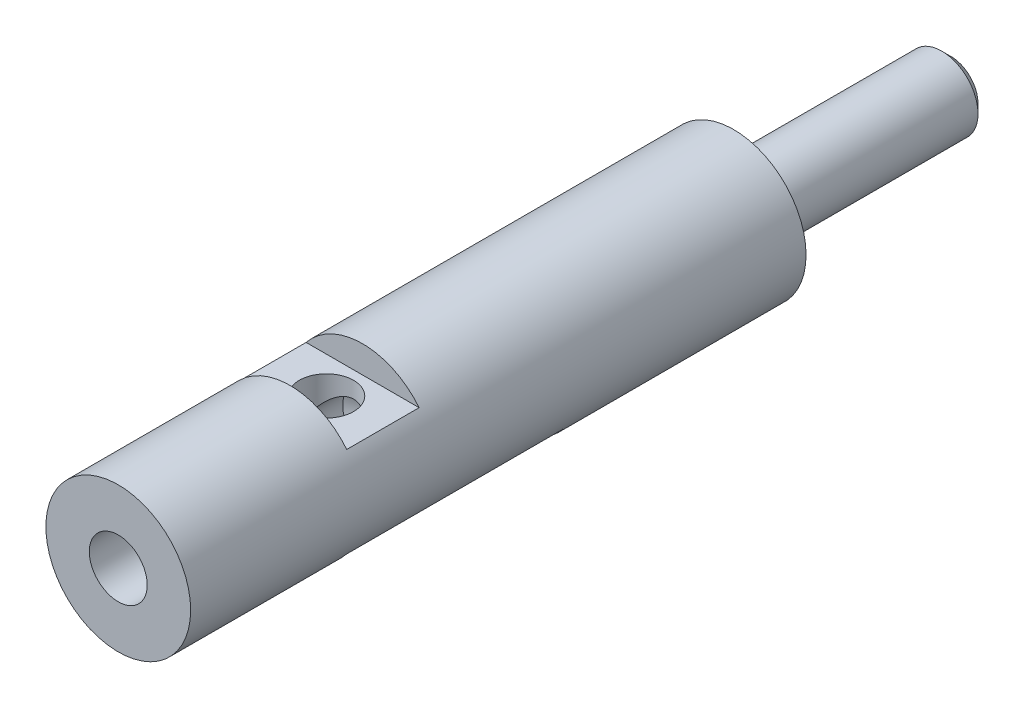
ISO-10303-21;
HEADER;
FILE_DESCRIPTION(('STEP AP214'),'2;1');
FILE_NAME('part.step','',(''),(''),'','','');
FILE_SCHEMA(('AUTOMOTIVE_DESIGN { 1 0 10303 214 1 1 1 1 }'));
ENDSEC;
DATA;
#1=APPLICATION_CONTEXT('core data for automotive mechanical design processes');
#2=APPLICATION_PROTOCOL_DEFINITION('international standard','automotive_design',2000,#1);
#3=PRODUCT_CONTEXT('',#1,'mechanical');
#4=PRODUCT('Part','Part','',(#3));
#5=PRODUCT_RELATED_PRODUCT_CATEGORY('part','',(#4));
#6=PRODUCT_DEFINITION_FORMATION('','',#4);
#7=PRODUCT_DEFINITION_CONTEXT('part definition',#1,'design');
#8=PRODUCT_DEFINITION('design','',#6,#7);
#9=PRODUCT_DEFINITION_SHAPE('','',#8);
#10=(LENGTH_UNIT() NAMED_UNIT(*) SI_UNIT(.MILLI.,.METRE.));
#11=(NAMED_UNIT(*) PLANE_ANGLE_UNIT() SI_UNIT($,.RADIAN.));
#12=(NAMED_UNIT(*) SI_UNIT($,.STERADIAN.) SOLID_ANGLE_UNIT());
#13=UNCERTAINTY_MEASURE_WITH_UNIT(LENGTH_MEASURE(1.E-05),#10,'distance_accuracy_value','');
#14=(GEOMETRIC_REPRESENTATION_CONTEXT(3) GLOBAL_UNCERTAINTY_ASSIGNED_CONTEXT((#13)) GLOBAL_UNIT_ASSIGNED_CONTEXT((#10,
#11,#12)) REPRESENTATION_CONTEXT('',''));
#15=CARTESIAN_POINT('',(0.,0.,0.));
#16=DIRECTION('',(0.,0.,1.));
#17=DIRECTION('',(1.,0.,0.));
#18=AXIS2_PLACEMENT_3D('',#15,#16,#17);
#19=CARTESIAN_POINT('',(0.,0.,-34.));
#20=DIRECTION('',(0.,0.,1.));
#21=DIRECTION('',(1.,0.,0.));
#22=AXIS2_PLACEMENT_3D('',#19,#20,#21);
#23=PLANE('',#22);
#24=CARTESIAN_POINT('',(0.,0.,-34.));
#25=DIRECTION('',(0.,0.,1.));
#26=DIRECTION('',(1.,0.,0.));
#27=AXIS2_PLACEMENT_3D('',#24,#25,#26);
#28=CIRCLE('',#27,4.);
#29=CARTESIAN_POINT('',(4.,0.,-34.));
#30=VERTEX_POINT('',#29);
#31=EDGE_CURVE('E111',#30,#30,#28,.T.);
#32=ORIENTED_EDGE('',*,*,#31,.F.);
#33=EDGE_LOOP('',(#32));
#34=FACE_BOUND('',#33,.T.);
#35=CARTESIAN_POINT('',(0.,0.,-34.));
#36=DIRECTION('',(0.,0.,1.));
#37=DIRECTION('',(1.,0.,0.));
#38=AXIS2_PLACEMENT_3D('',#35,#36,#37);
#39=CIRCLE('',#38,2.);
#40=CARTESIAN_POINT('',(2.,0.,-34.));
#41=VERTEX_POINT('',#40);
#42=EDGE_CURVE('E114',#41,#41,#39,.F.);
#43=ORIENTED_EDGE('',*,*,#42,.F.);
#44=EDGE_LOOP('',(#43));
#45=FACE_BOUND('',#44,.T.);
#46=ADVANCED_FACE('F35',(#34,#45),#23,.F.);
#47=CARTESIAN_POINT('',(0.,0.,-34.));
#48=DIRECTION('',(0.,0.,1.));
#49=DIRECTION('',(1.,0.,0.));
#50=AXIS2_PLACEMENT_3D('',#47,#48,#49);
#51=CYLINDRICAL_SURFACE('',#50,4.);
#52=DIRECTION('',(0.,0.,1.));
#53=VECTOR('',#52,1.);
#54=CARTESIAN_POINT('',(3.1224989991992,2.5,-34.));
#55=LINE('',#54,#53);
#56=CARTESIAN_POINT('',(3.1224989991992,2.5,-9.5));
#57=VERTEX_POINT('',#56);
#58=CARTESIAN_POINT('',(3.1224989991992,2.5,-13.5));
#59=VERTEX_POINT('',#58);
#60=EDGE_CURVE('E11',#57,#59,#55,.F.);
#61=ORIENTED_EDGE('',*,*,#60,.F.);
#62=CARTESIAN_POINT('',(0.,0.,-9.5));
#63=DIRECTION('',(0.,0.,1.));
#64=DIRECTION('',(1.,0.,0.));
#65=AXIS2_PLACEMENT_3D('',#62,#63,#64);
#66=CIRCLE('',#65,4.);
#67=CARTESIAN_POINT('',(-3.1224989991992,2.5,-9.5));
#68=VERTEX_POINT('',#67);
#69=EDGE_CURVE('E43',#68,#57,#66,.F.);
#70=ORIENTED_EDGE('',*,*,#69,.F.);
#71=DIRECTION('',(0.,0.,1.));
#72=VECTOR('',#71,1.);
#73=CARTESIAN_POINT('',(-3.1224989991992,2.5,-34.));
#74=LINE('',#73,#72);
#75=CARTESIAN_POINT('',(-3.1224989991992,2.5,-13.5));
#76=VERTEX_POINT('',#75);
#77=EDGE_CURVE('E80',#76,#68,#74,.T.);
#78=ORIENTED_EDGE('',*,*,#77,.F.);
#79=CARTESIAN_POINT('',(0.,0.,-13.5));
#80=DIRECTION('',(0.,0.,-1.));
#81=DIRECTION('',(-1.,0.,0.));
#82=AXIS2_PLACEMENT_3D('',#79,#80,#81);
#83=CIRCLE('',#82,4.);
#84=EDGE_CURVE('E76',#59,#76,#83,.F.);
#85=ORIENTED_EDGE('',*,*,#84,.F.);
#86=EDGE_LOOP('',(#61,#70,#78,#85));
#87=FACE_BOUND('',#86,.T.);
#88=CARTESIAN_POINT('',(0.,0.,-21.5));
#89=DIRECTION('',(0.,0.,-1.));
#90=DIRECTION('',(-1.,0.,0.));
#91=AXIS2_PLACEMENT_3D('',#88,#89,#90);
#92=CIRCLE('',#91,4.);
#93=CARTESIAN_POINT('',(-3.1224989991992,-2.5,-21.5));
#94=VERTEX_POINT('',#93);
#95=CARTESIAN_POINT('',(3.1224989991992,-2.5,-21.5));
#96=VERTEX_POINT('',#95);
#97=EDGE_CURVE('E125',#94,#96,#92,.F.);
#98=ORIENTED_EDGE('',*,*,#97,.F.);
#99=DIRECTION('',(0.,0.,1.));
#100=VECTOR('',#99,1.);
#101=CARTESIAN_POINT('',(-3.1224989991992,-2.5,-34.));
#102=LINE('',#101,#100);
#103=CARTESIAN_POINT('',(-3.1224989991992,-2.5,-9.5));
#104=VERTEX_POINT('',#103);
#105=EDGE_CURVE('E132',#104,#94,#102,.F.);
#106=ORIENTED_EDGE('',*,*,#105,.F.);
#107=CARTESIAN_POINT('',(0.,0.,-9.5));
#108=DIRECTION('',(0.,0.,1.));
#109=DIRECTION('',(1.,0.,0.));
#110=AXIS2_PLACEMENT_3D('',#107,#108,#109);
#111=CIRCLE('',#110,4.);
#112=CARTESIAN_POINT('',(3.1224989991992,-2.5,-9.5));
#113=VERTEX_POINT('',#112);
#114=EDGE_CURVE('E130',#113,#104,#111,.F.);
#115=ORIENTED_EDGE('',*,*,#114,.F.);
#116=DIRECTION('',(0.,0.,1.));
#117=VECTOR('',#116,1.);
#118=CARTESIAN_POINT('',(3.1224989991992,-2.5,-34.));
#119=LINE('',#118,#117);
#120=EDGE_CURVE('E127',#96,#113,#119,.T.);
#121=ORIENTED_EDGE('',*,*,#120,.F.);
#122=EDGE_LOOP('',(#98,#106,#115,#121));
#123=FACE_BOUND('',#122,.T.);
#124=ORIENTED_EDGE('',*,*,#31,.T.);
#125=EDGE_LOOP('',(#124));
#126=FACE_BOUND('',#125,.T.);
#127=CARTESIAN_POINT('',(0.,0.,0.));
#128=DIRECTION('',(0.,0.,1.));
#129=DIRECTION('',(1.,0.,0.));
#130=AXIS2_PLACEMENT_3D('',#127,#128,#129);
#131=CIRCLE('',#130,4.);
#132=CARTESIAN_POINT('',(4.,0.,0.));
#133=VERTEX_POINT('',#132);
#134=EDGE_CURVE('E110',#133,#133,#131,.T.);
#135=ORIENTED_EDGE('',*,*,#134,.F.);
#136=EDGE_LOOP('',(#135));
#137=FACE_BOUND('',#136,.T.);
#138=ADVANCED_FACE('F77',(#87,#123,#126,#137),#51,.T.);
#139=CARTESIAN_POINT('',(0.,0.,0.));
#140=DIRECTION('',(0.,0.,1.));
#141=DIRECTION('',(1.,0.,0.));
#142=AXIS2_PLACEMENT_3D('',#139,#140,#141);
#143=PLANE('',#142);
#144=CARTESIAN_POINT('',(0.,0.,0.));
#145=DIRECTION('',(0.,0.,1.));
#146=DIRECTION('',(1.,0.,0.));
#147=AXIS2_PLACEMENT_3D('',#144,#145,#146);
#148=CIRCLE('',#147,1.6);
#149=CARTESIAN_POINT('',(1.6,0.,0.));
#150=VERTEX_POINT('',#149);
#151=EDGE_CURVE('E103',#150,#150,#148,.T.);
#152=ORIENTED_EDGE('',*,*,#151,.F.);
#153=EDGE_LOOP('',(#152));
#154=FACE_BOUND('',#153,.T.);
#155=ORIENTED_EDGE('',*,*,#134,.T.);
#156=EDGE_LOOP('',(#155));
#157=FACE_BOUND('',#156,.T.);
#158=ADVANCED_FACE('F156',(#154,#157),#143,.T.);
#159=CARTESIAN_POINT('',(0.,0.,-46.));
#160=DIRECTION('',(0.,0.,1.));
#161=DIRECTION('',(1.,0.,0.));
#162=AXIS2_PLACEMENT_3D('',#159,#160,#161);
#163=CYLINDRICAL_SURFACE('',#162,2.);
#164=CARTESIAN_POINT('',(0.,0.,-45.5));
#165=DIRECTION('',(0.,0.,-1.));
#166=DIRECTION('',(-1.,0.,0.));
#167=AXIS2_PLACEMENT_3D('',#164,#165,#166);
#168=CIRCLE('',#167,2.);
#169=CARTESIAN_POINT('',(-2.,0.,-45.5));
#170=VERTEX_POINT('',#169);
#171=EDGE_CURVE('E122',#170,#170,#168,.F.);
#172=ORIENTED_EDGE('',*,*,#171,.T.);
#173=EDGE_LOOP('',(#172));
#174=FACE_BOUND('',#173,.T.);
#175=ORIENTED_EDGE('',*,*,#42,.T.);
#176=EDGE_LOOP('',(#175));
#177=FACE_BOUND('',#176,.T.);
#178=ADVANCED_FACE('F161',(#174,#177),#163,.T.);
#179=CARTESIAN_POINT('',(0.,0.,-46.));
#180=DIRECTION('',(0.,0.,-1.));
#181=DIRECTION('',(-1.,0.,0.));
#182=AXIS2_PLACEMENT_3D('',#179,#180,#181);
#183=PLANE('',#182);
#184=CARTESIAN_POINT('',(0.,0.,-46.));
#185=DIRECTION('',(0.,0.,-1.));
#186=DIRECTION('',(-1.,0.,0.));
#187=AXIS2_PLACEMENT_3D('',#184,#185,#186);
#188=CIRCLE('',#187,1.5);
#189=CARTESIAN_POINT('',(-1.5,0.,-46.));
#190=VERTEX_POINT('',#189);
#191=EDGE_CURVE('E119',#190,#190,#188,.T.);
#192=ORIENTED_EDGE('',*,*,#191,.T.);
#193=EDGE_LOOP('',(#192));
#194=FACE_BOUND('',#193,.T.);
#195=ADVANCED_FACE('F168',(#194),#183,.T.);
#196=CARTESIAN_POINT('',(0.,0.,-46.));
#197=DIRECTION('',(0.,0.,1.));
#198=DIRECTION('',(1.,0.,0.));
#199=AXIS2_PLACEMENT_3D('',#196,#197,#198);
#200=CONICAL_SURFACE('',#199,1.5,0.78539816339744);
#201=ORIENTED_EDGE('',*,*,#171,.F.);
#202=EDGE_LOOP('',(#201));
#203=FACE_BOUND('',#202,.T.);
#204=ORIENTED_EDGE('',*,*,#191,.F.);
#205=EDGE_LOOP('',(#204));
#206=FACE_BOUND('',#205,.T.);
#207=ADVANCED_FACE('F37',(#203,#206),#200,.T.);
#208=CARTESIAN_POINT('',(0.,0.,-14.));
#209=DIRECTION('',(0.,0.,1.));
#210=DIRECTION('',(1.,0.,0.));
#211=AXIS2_PLACEMENT_3D('',#208,#209,#210);
#212=CONICAL_SURFACE('',#211,1.6,1.02974425867665);
#213=CARTESIAN_POINT('',(0.,0.,-14.9613769904441));
#214=VERTEX_POINT('',#213);
#215=VERTEX_LOOP('',#214);
#216=FACE_BOUND('',#215,.T.);
#217=CARTESIAN_POINT('',(0.,0.,-14.));
#218=DIRECTION('',(0.,0.,1.));
#219=DIRECTION('',(1.,0.,0.));
#220=AXIS2_PLACEMENT_3D('',#217,#218,#219);
#221=CIRCLE('',#220,1.6);
#222=CARTESIAN_POINT('',(1.6,0.,-14.));
#223=VERTEX_POINT('',#222);
#224=EDGE_CURVE('E107',#223,#223,#221,.T.);
#225=ORIENTED_EDGE('',*,*,#224,.T.);
#226=EDGE_LOOP('',(#225));
#227=FACE_BOUND('',#226,.T.);
#228=ADVANCED_FACE('F178',(#216,#227),#212,.F.);
#229=CARTESIAN_POINT('',(0.,0.,0.));
#230=DIRECTION('',(0.,0.,1.));
#231=DIRECTION('',(1.,0.,0.));
#232=AXIS2_PLACEMENT_3D('',#229,#230,#231);
#233=CYLINDRICAL_SURFACE('',#232,1.6);
#234=CARTESIAN_POINT('',(0.,1.6,-10.));
#235=CARTESIAN_POINT('',(0.0684255819523125,1.59999100993067,-10.0000090962978));
#236=CARTESIAN_POINT('',(0.136969761419659,1.59556467819543,-10.0047281971339));
#237=CARTESIAN_POINT('',(0.271820864103849,1.57821703920186,-10.0232539049869));
#238=CARTESIAN_POINT('',(0.338120531372212,1.56527051953187,-10.0370874831407));
#239=CARTESIAN_POINT('',(0.466029039157558,1.5320418136178,-10.0726973534836));
#240=CARTESIAN_POINT('',(0.527667983699462,1.51181264687309,-10.0944162480474));
#241=CARTESIAN_POINT('',(0.645624057326149,1.46533125031909,-10.1445358019232));
#242=CARTESIAN_POINT('',(0.701942648568489,1.43908068217027,-10.172934617905));
#243=CARTESIAN_POINT('',(0.830488511004105,1.37023549959973,-10.2478632281665));
#244=CARTESIAN_POINT('',(0.899909356040595,1.32532924968792,-10.2970760172881));
#245=CARTESIAN_POINT('',(1.02730053831725,1.22924745848654,-10.4038236725768));
#246=CARTESIAN_POINT('',(1.08523092595497,1.17805101301526,-10.4613864091608));
#247=CARTESIAN_POINT('',(1.17078105057247,1.09156202300322,-10.560920796247));
#248=CARTESIAN_POINT('',(1.20175833727903,1.05726375119173,-10.6009408086179));
#249=CARTESIAN_POINT('',(1.25930890566739,0.988010810145925,-10.6834986333498));
#250=CARTESIAN_POINT('',(1.28588281199331,0.95305623479648,-10.7260360874337));
#251=CARTESIAN_POINT('',(1.33467012957743,0.883435608136702,-10.8135864668672));
#252=CARTESIAN_POINT('',(1.35689236994422,0.848769112188223,-10.8585941376334));
#253=CARTESIAN_POINT('',(1.39703622789021,0.780917148192504,-10.9514994512178));
#254=CARTESIAN_POINT('',(1.4149635108398,0.747729776660357,-10.9993931815076));
#255=CARTESIAN_POINT('',(1.44158488802393,0.694574099514469,-11.0838822859475));
#256=CARTESIAN_POINT('',(1.45143080990949,0.673647073701073,-11.1195046105091));
#257=CARTESIAN_POINT('',(1.46874054388632,0.63501608857097,-11.1930368336448));
#258=CARTESIAN_POINT('',(1.47620697945579,0.617308588918463,-11.2309441576764));
#259=CARTESIAN_POINT('',(1.48710185280875,0.590503680558265,-11.3012201572755));
#260=CARTESIAN_POINT('',(1.49104694938892,0.580381760051794,-11.3331032235742));
#261=CARTESIAN_POINT('',(1.49689488628612,0.56513278816246,-11.3981894510155));
#262=CARTESIAN_POINT('',(1.49880415766172,0.559990012702333,-11.4313881095201));
#263=CARTESIAN_POINT('',(1.50037685312532,0.555766816396775,-11.4985170672047));
#264=CARTESIAN_POINT('',(1.50002232907756,0.556734843369698,-11.5324510822661));
#265=CARTESIAN_POINT('',(1.49707243273785,0.564613886898917,-11.5995451956431));
#266=CARTESIAN_POINT('',(1.4944718971692,0.571538596916525,-11.6327033297862));
#267=CARTESIAN_POINT('',(1.48583868780731,0.593691355415265,-11.7107065522608));
#268=CARTESIAN_POINT('',(1.47883660489909,0.611158481279134,-11.7547767608288));
#269=CARTESIAN_POINT('',(1.46163501869307,0.651230780564013,-11.8398884700143));
#270=CARTESIAN_POINT('',(1.45142140048049,0.673858512219696,-11.8809155928409));
#271=CARTESIAN_POINT('',(1.42705633043943,0.724130291338607,-11.964295134449));
#272=CARTESIAN_POINT('',(1.41262082836605,0.752047417768103,-12.0063961883063));
#273=CARTESIAN_POINT('',(1.38053670392534,0.809448984794819,-12.0882594625084));
#274=CARTESIAN_POINT('',(1.362884843526,0.838934983462951,-12.1280192719695));
#275=CARTESIAN_POINT('',(1.30513055308309,0.928246532932007,-12.2444222286513));
#276=CARTESIAN_POINT('',(1.2602468147481,0.988886891758793,-12.3181312163075));
#277=CARTESIAN_POINT('',(1.15222226148888,1.11350800341085,-12.4651426434821));
#278=CARTESIAN_POINT('',(1.08770668085876,1.17721837960243,-12.5376707660719));
#279=CARTESIAN_POINT('',(0.941971511717611,1.29672721862759,-12.6714935311562));
#280=CARTESIAN_POINT('',(0.86081512421691,1.35255430540366,-12.7328290638758));
#281=CARTESIAN_POINT('',(0.715544871064865,1.43250376355304,-12.8199381988512));
#282=CARTESIAN_POINT('',(0.656464639142285,1.46066194156337,-12.8504193629851));
#283=CARTESIAN_POINT('',(0.532380202594942,1.51030557076397,-12.9039676752676));
#284=CARTESIAN_POINT('',(0.467379935912618,1.53179541632512,-12.9270397063194));
#285=CARTESIAN_POINT('',(0.332158679533425,1.5667103919271,-12.964454412966));
#286=CARTESIAN_POINT('',(0.261898429302641,1.58006627656505,-12.9787221497356));
#287=CARTESIAN_POINT('',(0.118916949535125,1.59719349756617,-12.9970096377307));
#288=CARTESIAN_POINT('',(0.0461977442778559,1.60097253214486,-13.0010376200462));
#289=CARTESIAN_POINT('',(-0.0898241742949615,1.59874226454321,-12.9986581904231));
#290=CARTESIAN_POINT('',(-0.153173912852364,1.59389115980748,-12.9934855518758));
#291=CARTESIAN_POINT('',(-0.277753685333707,1.57696068243675,-12.975403365772));
#292=CARTESIAN_POINT('',(-0.338983446812149,1.56488038437404,-12.9624928276668));
#293=CARTESIAN_POINT('',(-0.457735986419097,1.53435147837037,-12.9297793136347));
#294=CARTESIAN_POINT('',(-0.515265285072325,1.51591445776733,-12.9099888781736));
#295=CARTESIAN_POINT('',(-0.6258263213944,1.47371929048371,-12.8645218804443));
#296=CARTESIAN_POINT('',(-0.678856869780231,1.44995974275385,-12.8388437683204));
#297=CARTESIAN_POINT('',(-0.804323666257127,1.38569203947422,-12.7690194645366));
#298=CARTESIAN_POINT('',(-0.87381648537489,1.34262645456977,-12.7219326921356));
#299=CARTESIAN_POINT('',(-1.00176463057468,1.25009328041171,-12.6194762183997));
#300=CARTESIAN_POINT('',(-1.06018192297006,1.20060457993998,-12.5640791050474));
#301=CARTESIAN_POINT('',(-1.14747741148051,1.11605538641914,-12.4674270647179));
#302=CARTESIAN_POINT('',(-1.17951966582667,1.08204019580843,-12.4280484924891));
#303=CARTESIAN_POINT('',(-1.23917518469034,1.01317225735415,-12.3467515587634));
#304=CARTESIAN_POINT('',(-1.26678887424386,0.978319590257859,-12.3048334415346));
#305=CARTESIAN_POINT('',(-1.31764191463908,0.908666765165557,-12.218556692848));
#306=CARTESIAN_POINT('',(-1.34088972001462,0.873866637883969,-12.1742029978392));
#307=CARTESIAN_POINT('',(-1.38309994332715,0.805383294233525,-12.0827298984665));
#308=CARTESIAN_POINT('',(-1.40206704077597,0.77169889291498,-12.0356135858013));
#309=CARTESIAN_POINT('',(-1.43080243256964,0.716573830570098,-11.9518434003515));
#310=CARTESIAN_POINT('',(-1.44164985062666,0.694387989717429,-11.9160542008121));
#311=CARTESIAN_POINT('',(-1.46094173101545,0.652817311175948,-11.842208361234));
#312=CARTESIAN_POINT('',(-1.46938663186736,0.633431962644842,-11.8041521365202));
#313=CARTESIAN_POINT('',(-1.48226072963674,0.602605017567066,-11.7323453147986));
#314=CARTESIAN_POINT('',(-1.48713678412981,0.590364021627847,-11.6990307214481));
#315=CARTESIAN_POINT('',(-1.49468197065955,0.570995915270099,-11.6307524923585));
#316=CARTESIAN_POINT('',(-1.49735937115688,0.563849658605728,-11.5957955624772));
#317=CARTESIAN_POINT('',(-1.50022554535816,0.556188195946345,-11.5245568122864));
#318=CARTESIAN_POINT('',(-1.50038283453941,0.55575688368808,-11.488263900227));
#319=CARTESIAN_POINT('',(-1.49809981486309,0.561875339118353,-11.4163325816119));
#320=CARTESIAN_POINT('',(-1.49565398700772,0.568439939227119,-11.380695729265));
#321=CARTESIAN_POINT('',(-1.48749788637684,0.589493082818574,-11.3016563649173));
#322=CARTESIAN_POINT('',(-1.48107662983667,0.60566027751305,-11.2588024446771));
#323=CARTESIAN_POINT('',(-1.46519284514555,0.643137620116853,-11.175957538847));
#324=CARTESIAN_POINT('',(-1.45571686428682,0.664470411421166,-11.1359801921781));
#325=CARTESIAN_POINT('',(-1.43308878736762,0.712049693883338,-11.0548129753518));
#326=CARTESIAN_POINT('',(-1.41967554469701,0.738569250729511,-11.0138601198266));
#327=CARTESIAN_POINT('',(-1.3898503014609,0.793280785771192,-10.9342061780957));
#328=CARTESIAN_POINT('',(-1.37343521142803,0.821474466580567,-10.8955074664366));
#329=CARTESIAN_POINT('',(-1.31974256303734,0.907082200617778,-10.7821589547871));
#330=CARTESIAN_POINT('',(-1.27803283329948,0.96548843999586,-10.7103094131892));
#331=CARTESIAN_POINT('',(-1.1769333290914,1.0871265687091,-10.5653838564811));
#332=CARTESIAN_POINT('',(-1.11604484000417,1.15012229053261,-10.4931500874728));
#333=CARTESIAN_POINT('',(-0.978384321159499,1.26925092061594,-10.3589749614361));
#334=CARTESIAN_POINT('',(-0.901663440053357,1.32540502482408,-10.2970015909359));
#335=CARTESIAN_POINT('',(-0.761516551758893,1.40863661354703,-10.2059900545818));
#336=CARTESIAN_POINT('',(-0.702656139422069,1.43905674895611,-10.1729707472107));
#337=CARTESIAN_POINT('',(-0.578477152844968,1.49329683004652,-10.1143373223451));
#338=CARTESIAN_POINT('',(-0.5131629742583,1.51712122660309,-10.0887182106105));
#339=CARTESIAN_POINT('',(-0.38620040814015,1.55390938239857,-10.0492492504271));
#340=CARTESIAN_POINT('',(-0.325189090831627,1.56788580592608,-10.0342986233955));
#341=CARTESIAN_POINT('',(-0.200670425393284,1.58861097203543,-10.0121489553886));
#342=CARTESIAN_POINT('',(-0.137170487817767,1.5953796997283,-10.0049284803625));
#343=CARTESIAN_POINT('',(-0.0489577110306859,1.59944074803712,-10.0005966544392));
#344=CARTESIAN_POINT('',(-0.0244864493340314,1.60000321714293,-9.99999674484266));
#345=CARTESIAN_POINT('',(0.,1.6,-10.));
#346=B_SPLINE_CURVE_WITH_KNOTS('',3,(#234,#235,#236,#237,#238,#239,#240,#241,#242,#243,#244,
#245,#246,#247,#248,#249,#250,#251,#252,#253,#254,#255,#256,#257,#258,#259,#260,#261,#262,#263,
#264,#265,#266,#267,#268,#269,#270,#271,#272,#273,#274,#275,#276,#277,#278,#279,#280,#281,#282,
#283,#284,#285,#286,#287,#288,#289,#290,#291,#292,#293,#294,#295,#296,#297,#298,#299,#300,#301,
#302,#303,#304,#305,#306,#307,#308,#309,#310,#311,#312,#313,#314,#315,#316,#317,#318,#319,#320,
#321,#322,#323,#324,#325,#326,#327,#328,#329,#330,#331,#332,#333,#334,#335,#336,#337,#338,#339,
#340,#341,#342,#343,#344,#345),.UNSPECIFIED.,.T.,.F.,(4,2,2,2,2,2,2,2,2,2,2,2,2,2,2,2,2,2,2,2,2,
2,2,2,2,2,2,2,2,2,2,2,2,2,2,2,2,2,2,2,2,2,2,2,2,2,2,2,2,2,2,2,2,2,2,4),(0.,0.205191194350401,
0.410992324539083,0.615324504475547,0.819600364781852,1.10668891633045,1.39475875441689,
1.57797159708169,1.76115842768929,1.94396964900547,2.12653838431329,2.25379522043879,
2.380911261514,2.48161669197437,2.58200304846303,2.68318628478434,2.78460274869497,
2.92755182236974,3.07113816175827,3.22851946560475,3.38606009559674,3.70135424338248,
4.04810638258298,4.39356518751201,4.60938269160771,4.82505767038772,5.04254394703592,
5.25985534488231,5.45015751158171,5.64048404456584,5.83046545960809,6.02049694236051,
6.30198386380248,6.58442057318488,6.76754781754568,6.95065747555077,7.13340880043483,
7.31595937010024,7.4462672222547,7.57655127465,7.68369231421019,7.79042855986853,
7.8984972687514,8.00679555674798,8.14477595318693,8.28337249894484,8.43494757827373,
8.58667954401144,8.89033594061591,9.22956287389846,9.56771058052494,9.78902158846357,
10.0101828873086,10.2024308125783,10.3941442839538,10.4675730169056),.UNSPECIFIED.);
#347=CARTESIAN_POINT('',(0.,1.6,-10.));
#348=VERTEX_POINT('',#347);
#349=EDGE_CURVE('E93',#348,#348,#346,.T.);
#350=ORIENTED_EDGE('',*,*,#349,.T.);
#351=EDGE_LOOP('',(#350));
#352=FACE_BOUND('',#351,.T.);
#353=ORIENTED_EDGE('',*,*,#224,.F.);
#354=EDGE_LOOP('',(#353));
#355=FACE_BOUND('',#354,.T.);
#356=ORIENTED_EDGE('',*,*,#151,.T.);
#357=EDGE_LOOP('',(#356));
#358=FACE_BOUND('',#357,.T.);
#359=ADVANCED_FACE('F175',(#352,#355,#358),#233,.F.);
#360=CARTESIAN_POINT('',(-4.,-4.,-9.5));
#361=DIRECTION('',(0.,0.,1.));
#362=DIRECTION('',(1.,0.,0.));
#363=AXIS2_PLACEMENT_3D('',#360,#361,#362);
#364=PLANE('',#363);
#365=DIRECTION('',(1.,0.,0.));
#366=VECTOR('',#365,1.);
#367=CARTESIAN_POINT('',(-4.,-2.5,-9.5));
#368=LINE('',#367,#366);
#369=EDGE_CURVE('E91',#104,#113,#368,.T.);
#370=ORIENTED_EDGE('',*,*,#369,.T.);
#371=ORIENTED_EDGE('',*,*,#114,.T.);
#372=EDGE_LOOP('',(#370,#371));
#373=FACE_BOUND('',#372,.T.);
#374=ADVANCED_FACE('F177',(#373),#364,.F.);
#375=CARTESIAN_POINT('',(-4.,-2.5,-9.5));
#376=DIRECTION('',(0.,1.,0.));
#377=DIRECTION('',(0.,0.,1.));
#378=AXIS2_PLACEMENT_3D('',#375,#376,#377);
#379=PLANE('',#378);
#380=ORIENTED_EDGE('',*,*,#105,.T.);
#381=DIRECTION('',(1.,0.,0.));
#382=VECTOR('',#381,1.);
#383=CARTESIAN_POINT('',(-4.,-2.5,-21.5));
#384=LINE('',#383,#382);
#385=EDGE_CURVE('E88',#94,#96,#384,.T.);
#386=ORIENTED_EDGE('',*,*,#385,.T.);
#387=ORIENTED_EDGE('',*,*,#120,.T.);
#388=ORIENTED_EDGE('',*,*,#369,.F.);
#389=EDGE_LOOP('',(#380,#386,#387,#388));
#390=FACE_BOUND('',#389,.T.);
#391=ADVANCED_FACE('F145',(#390),#379,.F.);
#392=CARTESIAN_POINT('',(-4.,-4.,-21.5));
#393=DIRECTION('',(0.,0.,-1.));
#394=DIRECTION('',(-1.,0.,0.));
#395=AXIS2_PLACEMENT_3D('',#392,#393,#394);
#396=PLANE('',#395);
#397=ORIENTED_EDGE('',*,*,#385,.F.);
#398=ORIENTED_EDGE('',*,*,#97,.T.);
#399=EDGE_LOOP('',(#397,#398));
#400=FACE_BOUND('',#399,.T.);
#401=ADVANCED_FACE('F138',(#400),#396,.F.);
#402=CARTESIAN_POINT('',(-4.,4.,-9.5));
#403=DIRECTION('',(0.,0.,1.));
#404=DIRECTION('',(1.,0.,0.));
#405=AXIS2_PLACEMENT_3D('',#402,#403,#404);
#406=PLANE('',#405);
#407=ORIENTED_EDGE('',*,*,#69,.T.);
#408=DIRECTION('',(1.,0.,0.));
#409=VECTOR('',#408,1.);
#410=CARTESIAN_POINT('',(-4.,2.5,-9.5));
#411=LINE('',#410,#409);
#412=EDGE_CURVE('E86',#68,#57,#411,.T.);
#413=ORIENTED_EDGE('',*,*,#412,.F.);
#414=EDGE_LOOP('',(#407,#413));
#415=FACE_BOUND('',#414,.T.);
#416=ADVANCED_FACE('F136',(#415),#406,.F.);
#417=CARTESIAN_POINT('',(-4.,4.,-13.5));
#418=DIRECTION('',(0.,0.,-1.));
#419=DIRECTION('',(-1.,0.,0.));
#420=AXIS2_PLACEMENT_3D('',#417,#418,#419);
#421=PLANE('',#420);
#422=DIRECTION('',(1.,0.,0.));
#423=VECTOR('',#422,1.);
#424=CARTESIAN_POINT('',(-4.,2.5,-13.5));
#425=LINE('',#424,#423);
#426=EDGE_CURVE('E49',#76,#59,#425,.T.);
#427=ORIENTED_EDGE('',*,*,#426,.T.);
#428=ORIENTED_EDGE('',*,*,#84,.T.);
#429=EDGE_LOOP('',(#427,#428));
#430=FACE_BOUND('',#429,.T.);
#431=ADVANCED_FACE('F87',(#430),#421,.F.);
#432=CARTESIAN_POINT('',(-4.,2.5,-9.5));
#433=DIRECTION('',(0.,-1.,0.));
#434=DIRECTION('',(0.,0.,-1.));
#435=AXIS2_PLACEMENT_3D('',#432,#433,#434);
#436=PLANE('',#435);
#437=CARTESIAN_POINT('',(0.,2.5,-11.5));
#438=DIRECTION('',(0.,1.,0.));
#439=DIRECTION('',(0.,0.,1.));
#440=AXIS2_PLACEMENT_3D('',#437,#438,#439);
#441=CIRCLE('',#440,1.49999999999999);
#442=CARTESIAN_POINT('',(0.,2.5,-10.));
#443=VERTEX_POINT('',#442);
#444=EDGE_CURVE('E276',#443,#443,#441,.T.);
#445=ORIENTED_EDGE('',*,*,#444,.F.);
#446=EDGE_LOOP('',(#445));
#447=FACE_BOUND('',#446,.T.);
#448=ORIENTED_EDGE('',*,*,#60,.T.);
#449=ORIENTED_EDGE('',*,*,#426,.F.);
#450=ORIENTED_EDGE('',*,*,#77,.T.);
#451=ORIENTED_EDGE('',*,*,#412,.T.);
#452=EDGE_LOOP('',(#448,#449,#450,#451));
#453=FACE_BOUND('',#452,.T.);
#454=ADVANCED_FACE('F84',(#447,#453),#436,.F.);
#455=CARTESIAN_POINT('',(0.,2.5,-11.5));
#456=DIRECTION('',(0.,1.,0.));
#457=DIRECTION('',(0.,0.,1.));
#458=AXIS2_PLACEMENT_3D('',#455,#456,#457);
#459=CYLINDRICAL_SURFACE('',#458,1.49999999999999);
#460=ORIENTED_EDGE('',*,*,#349,.F.);
#461=EDGE_LOOP('',(#460));
#462=FACE_BOUND('',#461,.T.);
#463=ORIENTED_EDGE('',*,*,#444,.T.);
#464=EDGE_LOOP('',(#463));
#465=FACE_BOUND('',#464,.T.);
#466=ADVANCED_FACE('F258',(#462,#465),#459,.F.);
#467=CLOSED_SHELL('',(#46,#138,#158,#178,#195,#207,#228,#359,#374,#391,#401,#416,#431,#454,#466));
#468=MANIFOLD_SOLID_BREP('B2',#467);
#469=ADVANCED_BREP_SHAPE_REPRESENTATION('',(#18,#468),#14);
#470=SHAPE_DEFINITION_REPRESENTATION(#9,#469);
ENDSEC;
END-ISO-10303-21;
